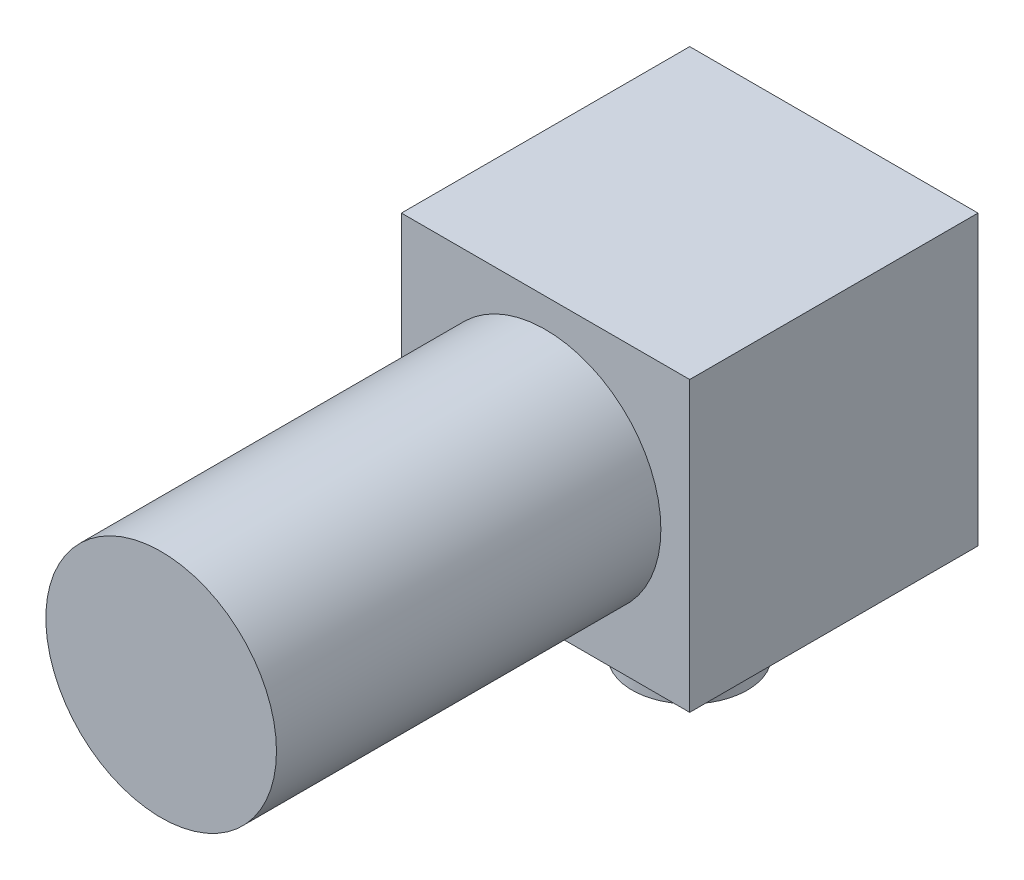
ISO-10303-21;
HEADER;
FILE_DESCRIPTION(('STEP AP214'),'2;1');
FILE_NAME('part.step','',(''),(''),'','','');
FILE_SCHEMA(('AUTOMOTIVE_DESIGN { 1 0 10303 214 1 1 1 1 }'));
ENDSEC;
DATA;
#1=APPLICATION_CONTEXT('core data for automotive mechanical design processes');
#2=APPLICATION_PROTOCOL_DEFINITION('international standard','automotive_design',2000,#1);
#3=PRODUCT_CONTEXT('',#1,'mechanical');
#4=PRODUCT('Part','Part','',(#3));
#5=PRODUCT_RELATED_PRODUCT_CATEGORY('part','',(#4));
#6=PRODUCT_DEFINITION_FORMATION('','',#4);
#7=PRODUCT_DEFINITION_CONTEXT('part definition',#1,'design');
#8=PRODUCT_DEFINITION('design','',#6,#7);
#9=PRODUCT_DEFINITION_SHAPE('','',#8);
#10=(LENGTH_UNIT() NAMED_UNIT(*) SI_UNIT(.MILLI.,.METRE.));
#11=(NAMED_UNIT(*) PLANE_ANGLE_UNIT() SI_UNIT($,.RADIAN.));
#12=(NAMED_UNIT(*) SI_UNIT($,.STERADIAN.) SOLID_ANGLE_UNIT());
#13=UNCERTAINTY_MEASURE_WITH_UNIT(LENGTH_MEASURE(1.E-05),#10,'distance_accuracy_value','');
#14=(GEOMETRIC_REPRESENTATION_CONTEXT(3) GLOBAL_UNCERTAINTY_ASSIGNED_CONTEXT((#13)) GLOBAL_UNIT_ASSIGNED_CONTEXT((#10,
#11,#12)) REPRESENTATION_CONTEXT('',''));
#15=CARTESIAN_POINT('',(0.,0.,0.));
#16=DIRECTION('',(0.,0.,1.));
#17=DIRECTION('',(1.,0.,0.));
#18=AXIS2_PLACEMENT_3D('',#15,#16,#17);
#19=CARTESIAN_POINT('',(7.5,7.5,15.));
#20=DIRECTION('',(-1.,0.,0.));
#21=DIRECTION('',(0.,-1.,0.));
#22=AXIS2_PLACEMENT_3D('',#19,#20,#21);
#23=PLANE('',#22);
#24=DIRECTION('',(0.,1.,0.));
#25=VECTOR('',#24,1.);
#26=CARTESIAN_POINT('',(7.5,7.5,0.));
#27=LINE('',#26,#25);
#28=CARTESIAN_POINT('',(7.5,-7.5,0.));
#29=VERTEX_POINT('',#28);
#30=CARTESIAN_POINT('',(7.5,7.5,0.));
#31=VERTEX_POINT('',#30);
#32=EDGE_CURVE('E100',#29,#31,#27,.T.);
#33=ORIENTED_EDGE('',*,*,#32,.T.);
#34=DIRECTION('',(0.,0.,-1.));
#35=VECTOR('',#34,1.);
#36=CARTESIAN_POINT('',(7.5,7.5,15.));
#37=LINE('',#36,#35);
#38=CARTESIAN_POINT('',(7.5,7.5,15.));
#39=VERTEX_POINT('',#38);
#40=EDGE_CURVE('E36',#39,#31,#37,.T.);
#41=ORIENTED_EDGE('',*,*,#40,.F.);
#42=DIRECTION('',(0.,1.,0.));
#43=VECTOR('',#42,1.);
#44=CARTESIAN_POINT('',(7.5,7.5,15.));
#45=LINE('',#44,#43);
#46=CARTESIAN_POINT('',(7.5,-7.5,15.));
#47=VERTEX_POINT('',#46);
#48=EDGE_CURVE('E87',#47,#39,#45,.T.);
#49=ORIENTED_EDGE('',*,*,#48,.F.);
#50=DIRECTION('',(0.,0.,-1.));
#51=VECTOR('',#50,1.);
#52=CARTESIAN_POINT('',(7.5,-7.5,15.));
#53=LINE('',#52,#51);
#54=EDGE_CURVE('E96',#47,#29,#53,.T.);
#55=ORIENTED_EDGE('',*,*,#54,.T.);
#56=EDGE_LOOP('',(#33,#41,#49,#55));
#57=FACE_BOUND('',#56,.T.);
#58=ADVANCED_FACE('F33',(#57),#23,.F.);
#59=CARTESIAN_POINT('',(-7.5,7.5,15.));
#60=DIRECTION('',(0.,-1.,0.));
#61=DIRECTION('',(0.,0.,-1.));
#62=AXIS2_PLACEMENT_3D('',#59,#60,#61);
#63=PLANE('',#62);
#64=DIRECTION('',(-1.,0.,0.));
#65=VECTOR('',#64,1.);
#66=CARTESIAN_POINT('',(-7.5,7.5,0.));
#67=LINE('',#66,#65);
#68=CARTESIAN_POINT('',(-7.5,7.5,0.));
#69=VERTEX_POINT('',#68);
#70=EDGE_CURVE('E92',#31,#69,#67,.T.);
#71=ORIENTED_EDGE('',*,*,#70,.T.);
#72=DIRECTION('',(0.,0.,-1.));
#73=VECTOR('',#72,1.);
#74=CARTESIAN_POINT('',(-7.5,7.5,15.));
#75=LINE('',#74,#73);
#76=CARTESIAN_POINT('',(-7.5,7.5,15.));
#77=VERTEX_POINT('',#76);
#78=EDGE_CURVE('E90',#77,#69,#75,.T.);
#79=ORIENTED_EDGE('',*,*,#78,.F.);
#80=DIRECTION('',(-1.,0.,0.));
#81=VECTOR('',#80,1.);
#82=CARTESIAN_POINT('',(-7.5,7.5,15.));
#83=LINE('',#82,#81);
#84=EDGE_CURVE('E82',#39,#77,#83,.T.);
#85=ORIENTED_EDGE('',*,*,#84,.F.);
#86=ORIENTED_EDGE('',*,*,#40,.T.);
#87=EDGE_LOOP('',(#71,#79,#85,#86));
#88=FACE_BOUND('',#87,.T.);
#89=ADVANCED_FACE('F91',(#88),#63,.F.);
#90=CARTESIAN_POINT('',(-7.5,7.5,15.));
#91=DIRECTION('',(1.,0.,0.));
#92=DIRECTION('',(0.,1.,0.));
#93=AXIS2_PLACEMENT_3D('',#90,#91,#92);
#94=PLANE('',#93);
#95=DIRECTION('',(0.,-1.,0.));
#96=VECTOR('',#95,1.);
#97=CARTESIAN_POINT('',(-7.5,7.5,0.));
#98=LINE('',#97,#96);
#99=CARTESIAN_POINT('',(-7.5,-7.5,0.));
#100=VERTEX_POINT('',#99);
#101=EDGE_CURVE('E68',#69,#100,#98,.T.);
#102=ORIENTED_EDGE('',*,*,#101,.T.);
#103=DIRECTION('',(0.,0.,-1.));
#104=VECTOR('',#103,1.);
#105=CARTESIAN_POINT('',(-7.5,-7.5,15.));
#106=LINE('',#105,#104);
#107=CARTESIAN_POINT('',(-7.5,-7.5,15.));
#108=VERTEX_POINT('',#107);
#109=EDGE_CURVE('E93',#108,#100,#106,.T.);
#110=ORIENTED_EDGE('',*,*,#109,.F.);
#111=DIRECTION('',(0.,-1.,0.));
#112=VECTOR('',#111,1.);
#113=CARTESIAN_POINT('',(-7.5,7.5,15.));
#114=LINE('',#113,#112);
#115=EDGE_CURVE('E85',#77,#108,#114,.T.);
#116=ORIENTED_EDGE('',*,*,#115,.F.);
#117=ORIENTED_EDGE('',*,*,#78,.T.);
#118=EDGE_LOOP('',(#102,#110,#116,#117));
#119=FACE_BOUND('',#118,.T.);
#120=ADVANCED_FACE('F94',(#119),#94,.F.);
#121=CARTESIAN_POINT('',(-7.5,-7.5,15.));
#122=DIRECTION('',(0.,1.,0.));
#123=DIRECTION('',(0.,0.,1.));
#124=AXIS2_PLACEMENT_3D('',#121,#122,#123);
#125=PLANE('',#124);
#126=CARTESIAN_POINT('',(0.,-7.5,7.5));
#127=DIRECTION('',(0.,-1.,0.));
#128=DIRECTION('',(0.,0.,-1.));
#129=AXIS2_PLACEMENT_3D('',#126,#127,#128);
#130=CIRCLE('',#129,3.);
#131=CARTESIAN_POINT('',(0.,-7.5,4.5));
#132=VERTEX_POINT('',#131);
#133=EDGE_CURVE('E11',#132,#132,#130,.T.);
#134=ORIENTED_EDGE('',*,*,#133,.F.);
#135=EDGE_LOOP('',(#134));
#136=FACE_BOUND('',#135,.T.);
#137=DIRECTION('',(1.,0.,0.));
#138=VECTOR('',#137,1.);
#139=CARTESIAN_POINT('',(-7.5,-7.5,0.));
#140=LINE('',#139,#138);
#141=EDGE_CURVE('E74',#100,#29,#140,.T.);
#142=ORIENTED_EDGE('',*,*,#141,.T.);
#143=ORIENTED_EDGE('',*,*,#54,.F.);
#144=DIRECTION('',(1.,0.,0.));
#145=VECTOR('',#144,1.);
#146=CARTESIAN_POINT('',(-7.5,-7.5,15.));
#147=LINE('',#146,#145);
#148=EDGE_CURVE('E51',#108,#47,#147,.T.);
#149=ORIENTED_EDGE('',*,*,#148,.F.);
#150=ORIENTED_EDGE('',*,*,#109,.T.);
#151=EDGE_LOOP('',(#142,#143,#149,#150));
#152=FACE_BOUND('',#151,.T.);
#153=ADVANCED_FACE('F108',(#136,#152),#125,.F.);
#154=CARTESIAN_POINT('',(0.,0.,15.));
#155=DIRECTION('',(0.,0.,1.));
#156=DIRECTION('',(1.,0.,0.));
#157=AXIS2_PLACEMENT_3D('',#154,#155,#156);
#158=PLANE('',#157);
#159=CARTESIAN_POINT('',(0.,0.,15.));
#160=DIRECTION('',(0.,0.,1.));
#161=DIRECTION('',(1.,0.,0.));
#162=AXIS2_PLACEMENT_3D('',#159,#160,#161);
#163=CIRCLE('',#162,6.);
#164=CARTESIAN_POINT('',(6.,0.,15.));
#165=VERTEX_POINT('',#164);
#166=EDGE_CURVE('E42',#165,#165,#163,.T.);
#167=ORIENTED_EDGE('',*,*,#166,.F.);
#168=EDGE_LOOP('',(#167));
#169=FACE_BOUND('',#168,.T.);
#170=ORIENTED_EDGE('',*,*,#48,.T.);
#171=ORIENTED_EDGE('',*,*,#84,.T.);
#172=ORIENTED_EDGE('',*,*,#115,.T.);
#173=ORIENTED_EDGE('',*,*,#148,.T.);
#174=EDGE_LOOP('',(#170,#171,#172,#173));
#175=FACE_BOUND('',#174,.T.);
#176=ADVANCED_FACE('F83',(#169,#175),#158,.T.);
#177=CARTESIAN_POINT('',(0.,0.,0.));
#178=DIRECTION('',(0.,0.,1.));
#179=DIRECTION('',(1.,0.,0.));
#180=AXIS2_PLACEMENT_3D('',#177,#178,#179);
#181=PLANE('',#180);
#182=CARTESIAN_POINT('',(0.,0.,0.));
#183=DIRECTION('',(0.,0.,-1.));
#184=DIRECTION('',(-1.,0.,0.));
#185=AXIS2_PLACEMENT_3D('',#182,#183,#184);
#186=CIRCLE('',#185,6.);
#187=CARTESIAN_POINT('',(-6.,0.,0.));
#188=VERTEX_POINT('',#187);
#189=EDGE_CURVE('E119',#188,#188,#186,.T.);
#190=ORIENTED_EDGE('',*,*,#189,.F.);
#191=EDGE_LOOP('',(#190));
#192=FACE_BOUND('',#191,.T.);
#193=ORIENTED_EDGE('',*,*,#32,.F.);
#194=ORIENTED_EDGE('',*,*,#141,.F.);
#195=ORIENTED_EDGE('',*,*,#101,.F.);
#196=ORIENTED_EDGE('',*,*,#70,.F.);
#197=EDGE_LOOP('',(#193,#194,#195,#196));
#198=FACE_BOUND('',#197,.T.);
#199=ADVANCED_FACE('F111',(#192,#198),#181,.F.);
#200=CARTESIAN_POINT('',(0.,0.,35.));
#201=DIRECTION('',(0.,0.,-1.));
#202=DIRECTION('',(-1.,0.,0.));
#203=AXIS2_PLACEMENT_3D('',#200,#201,#202);
#204=CYLINDRICAL_SURFACE('',#203,6.);
#205=CARTESIAN_POINT('',(0.,0.,35.));
#206=DIRECTION('',(0.,0.,1.));
#207=DIRECTION('',(1.,0.,0.));
#208=AXIS2_PLACEMENT_3D('',#205,#206,#207);
#209=CIRCLE('',#208,6.);
#210=CARTESIAN_POINT('',(6.,0.,35.));
#211=VERTEX_POINT('',#210);
#212=EDGE_CURVE('E103',#211,#211,#209,.T.);
#213=ORIENTED_EDGE('',*,*,#212,.F.);
#214=EDGE_LOOP('',(#213));
#215=FACE_BOUND('',#214,.T.);
#216=ORIENTED_EDGE('',*,*,#166,.T.);
#217=EDGE_LOOP('',(#216));
#218=FACE_BOUND('',#217,.T.);
#219=ADVANCED_FACE('F171',(#215,#218),#204,.T.);
#220=CARTESIAN_POINT('',(0.,0.,35.));
#221=DIRECTION('',(0.,0.,1.));
#222=DIRECTION('',(1.,0.,0.));
#223=AXIS2_PLACEMENT_3D('',#220,#221,#222);
#224=PLANE('',#223);
#225=ORIENTED_EDGE('',*,*,#212,.T.);
#226=EDGE_LOOP('',(#225));
#227=FACE_BOUND('',#226,.T.);
#228=ADVANCED_FACE('F176',(#227),#224,.T.);
#229=CARTESIAN_POINT('',(0.,0.,10.));
#230=DIRECTION('',(0.,0.,-1.));
#231=DIRECTION('',(-1.,0.,0.));
#232=AXIS2_PLACEMENT_3D('',#229,#230,#231);
#233=CYLINDRICAL_SURFACE('',#232,6.);
#234=CARTESIAN_POINT('',(0.,0.,10.));
#235=DIRECTION('',(0.,0.,-1.));
#236=DIRECTION('',(-1.,0.,0.));
#237=AXIS2_PLACEMENT_3D('',#234,#235,#236);
#238=CIRCLE('',#237,6.);
#239=CARTESIAN_POINT('',(-6.,0.,10.));
#240=VERTEX_POINT('',#239);
#241=EDGE_CURVE('E118',#240,#240,#238,.T.);
#242=ORIENTED_EDGE('',*,*,#241,.F.);
#243=EDGE_LOOP('',(#242));
#244=FACE_BOUND('',#243,.T.);
#245=ORIENTED_EDGE('',*,*,#189,.T.);
#246=EDGE_LOOP('',(#245));
#247=FACE_BOUND('',#246,.T.);
#248=ADVANCED_FACE('F186',(#244,#247),#233,.F.);
#249=CARTESIAN_POINT('',(0.,0.,10.));
#250=DIRECTION('',(0.,0.,-1.));
#251=DIRECTION('',(-1.,0.,0.));
#252=AXIS2_PLACEMENT_3D('',#249,#250,#251);
#253=PLANE('',#252);
#254=ORIENTED_EDGE('',*,*,#241,.T.);
#255=EDGE_LOOP('',(#254));
#256=FACE_BOUND('',#255,.T.);
#257=ADVANCED_FACE('F133',(#256),#253,.T.);
#258=CARTESIAN_POINT('',(0.,-12.5,7.5));
#259=DIRECTION('',(0.,1.,0.));
#260=DIRECTION('',(0.,0.,1.));
#261=AXIS2_PLACEMENT_3D('',#258,#259,#260);
#262=CYLINDRICAL_SURFACE('',#261,3.);
#263=CARTESIAN_POINT('',(0.,-12.5,7.5));
#264=DIRECTION('',(0.,-1.,0.));
#265=DIRECTION('',(0.,0.,-1.));
#266=AXIS2_PLACEMENT_3D('',#263,#264,#265);
#267=CIRCLE('',#266,3.);
#268=CARTESIAN_POINT('',(0.,-12.5,4.5));
#269=VERTEX_POINT('',#268);
#270=EDGE_CURVE('E122',#269,#269,#267,.T.);
#271=ORIENTED_EDGE('',*,*,#270,.F.);
#272=EDGE_LOOP('',(#271));
#273=FACE_BOUND('',#272,.T.);
#274=ORIENTED_EDGE('',*,*,#133,.T.);
#275=EDGE_LOOP('',(#274));
#276=FACE_BOUND('',#275,.T.);
#277=ADVANCED_FACE('F130',(#273,#276),#262,.T.);
#278=CARTESIAN_POINT('',(0.,-12.5,7.5));
#279=DIRECTION('',(0.,-1.,0.));
#280=DIRECTION('',(0.,0.,-1.));
#281=AXIS2_PLACEMENT_3D('',#278,#279,#280);
#282=PLANE('',#281);
#283=ORIENTED_EDGE('',*,*,#270,.T.);
#284=EDGE_LOOP('',(#283));
#285=FACE_BOUND('',#284,.T.);
#286=ADVANCED_FACE('F128',(#285),#282,.T.);
#287=CLOSED_SHELL('',(#58,#89,#120,#153,#176,#199,#219,#228,#248,#257,#277,#286));
#288=MANIFOLD_SOLID_BREP('B2',#287);
#289=ADVANCED_BREP_SHAPE_REPRESENTATION('',(#18,#288),#14);
#290=SHAPE_DEFINITION_REPRESENTATION(#9,#289);
ENDSEC;
END-ISO-10303-21;
